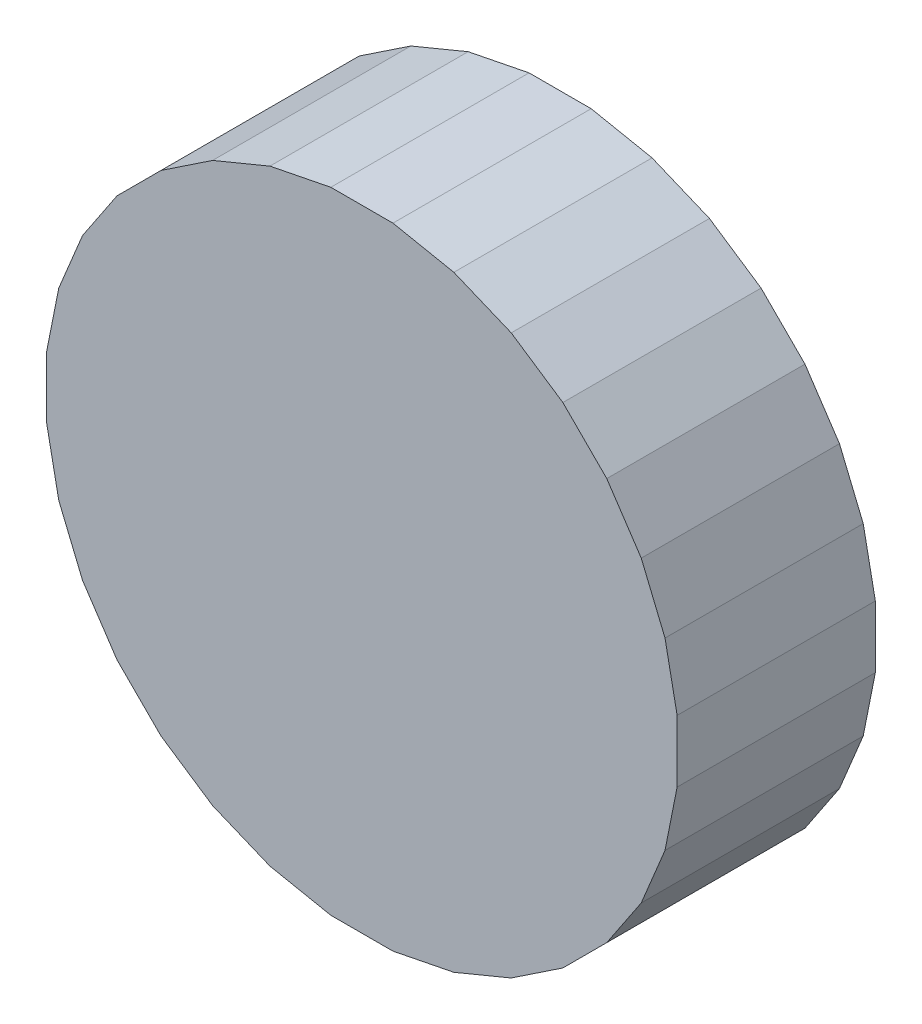
ISO-10303-21;
HEADER;
FILE_DESCRIPTION(('STEP AP214'),'2;1');
FILE_NAME('part.step','',(''),(''),'','','');
FILE_SCHEMA(('AUTOMOTIVE_DESIGN { 1 0 10303 214 1 1 1 1 }'));
ENDSEC;
DATA;
#1=APPLICATION_CONTEXT('core data for automotive mechanical design processes');
#2=APPLICATION_PROTOCOL_DEFINITION('international standard','automotive_design',2000,#1);
#3=PRODUCT_CONTEXT('',#1,'mechanical');
#4=PRODUCT('Part','Part','',(#3));
#5=PRODUCT_RELATED_PRODUCT_CATEGORY('part','',(#4));
#6=PRODUCT_DEFINITION_FORMATION('','',#4);
#7=PRODUCT_DEFINITION_CONTEXT('part definition',#1,'design');
#8=PRODUCT_DEFINITION('design','',#6,#7);
#9=PRODUCT_DEFINITION_SHAPE('','',#8);
#10=(LENGTH_UNIT() NAMED_UNIT(*) SI_UNIT(.MILLI.,.METRE.));
#11=(NAMED_UNIT(*) PLANE_ANGLE_UNIT() SI_UNIT($,.RADIAN.));
#12=(NAMED_UNIT(*) SI_UNIT($,.STERADIAN.) SOLID_ANGLE_UNIT());
#13=UNCERTAINTY_MEASURE_WITH_UNIT(LENGTH_MEASURE(1.E-05),#10,'distance_accuracy_value','');
#14=(GEOMETRIC_REPRESENTATION_CONTEXT(3) GLOBAL_UNCERTAINTY_ASSIGNED_CONTEXT((#13)) GLOBAL_UNIT_ASSIGNED_CONTEXT((#10,
#11,#12)) REPRESENTATION_CONTEXT('',''));
#15=CARTESIAN_POINT('',(0.,0.,0.));
#16=DIRECTION('',(0.,0.,1.));
#17=DIRECTION('',(1.,0.,0.));
#18=AXIS2_PLACEMENT_3D('',#15,#16,#17);
#19=CARTESIAN_POINT('',(-9.570449612419E-07,-9.570449580856E-07,1.10000034));
#20=DIRECTION('',(0.,0.,-1.));
#21=DIRECTION('',(0.,-1.,0.));
#22=AXIS2_PLACEMENT_3D('',#19,#20,#21);
#23=PLANE('',#22);
#24=DIRECTION('',(0.,-1.,0.));
#25=VECTOR('',#24,1.);
#26=CARTESIAN_POINT('',(1.74949104,0.,1.10000034));
#27=LINE('',#26,#25);
#28=CARTESIAN_POINT('',(1.74949104,0.17230852,1.10000034));
#29=VERTEX_POINT('',#28);
#30=CARTESIAN_POINT('',(1.74949104,-0.17231106,1.10000034));
#31=VERTEX_POINT('',#30);
#32=EDGE_CURVE('E552',#29,#31,#27,.T.);
#33=ORIENTED_EDGE('',*,*,#32,.F.);
#34=DIRECTION('',(0.195095506676965,-0.980784249095824,0.));
#35=VECTOR('',#34,1.);
#36=CARTESIAN_POINT('',(1.68225724,0.51030632,1.10000034));
#37=LINE('',#36,#35);
#38=CARTESIAN_POINT('',(1.68225724,0.51030632,1.10000034));
#39=VERTEX_POINT('',#38);
#40=EDGE_CURVE('E303',#39,#29,#37,.T.);
#41=ORIENTED_EDGE('',*,*,#40,.F.);
#42=DIRECTION('',(0.382681822916955,-0.92388019916489,0.));
#43=VECTOR('',#42,1.);
#44=CARTESIAN_POINT('',(1.5503779,0.82869278,1.10000034));
#45=LINE('',#44,#43);
#46=CARTESIAN_POINT('',(1.5503779,0.82869278,1.10000034));
#47=VERTEX_POINT('',#46);
#48=EDGE_CURVE('E306',#47,#39,#45,.T.);
#49=ORIENTED_EDGE('',*,*,#48,.F.);
#50=DIRECTION('',(0.55556733623308,-0.831471547866119,0.));
#51=VECTOR('',#50,1.);
#52=CARTESIAN_POINT('',(1.35891778,1.11523526,1.10000034));
#53=LINE('',#52,#51);
#54=CARTESIAN_POINT('',(1.35891778,1.11523526,1.10000034));
#55=VERTEX_POINT('',#54);
#56=EDGE_CURVE('E456',#55,#47,#53,.T.);
#57=ORIENTED_EDGE('',*,*,#56,.F.);
#58=DIRECTION('',(0.707106781186548,-0.707106781186548,0.));
#59=VECTOR('',#58,1.);
#60=CARTESIAN_POINT('',(1.11523526,1.35891778,1.10000034));
#61=LINE('',#60,#59);
#62=CARTESIAN_POINT('',(1.11523526,1.35891778,1.10000034));
#63=VERTEX_POINT('',#62);
#64=EDGE_CURVE('E472',#63,#55,#61,.T.);
#65=ORIENTED_EDGE('',*,*,#64,.F.);
#66=DIRECTION('',(0.831471547866119,-0.55556733623308,0.));
#67=VECTOR('',#66,1.);
#68=CARTESIAN_POINT('',(0.82869278,1.5503779,1.10000034));
#69=LINE('',#68,#67);
#70=CARTESIAN_POINT('',(0.82869278,1.5503779,1.10000034));
#71=VERTEX_POINT('',#70);
#72=EDGE_CURVE('E408',#71,#63,#69,.T.);
#73=ORIENTED_EDGE('',*,*,#72,.F.);
#74=DIRECTION('',(0.92388019916489,-0.382681822916955,0.));
#75=VECTOR('',#74,1.);
#76=CARTESIAN_POINT('',(0.51030632,1.68225724,1.10000034));
#77=LINE('',#76,#75);
#78=CARTESIAN_POINT('',(0.51030632,1.68225724,1.10000034));
#79=VERTEX_POINT('',#78);
#80=EDGE_CURVE('E423',#79,#71,#77,.T.);
#81=ORIENTED_EDGE('',*,*,#80,.F.);
#82=DIRECTION('',(0.980784249095824,-0.195095506676965,0.));
#83=VECTOR('',#82,1.);
#84=CARTESIAN_POINT('',(0.17230852,1.74949104,1.10000034));
#85=LINE('',#84,#83);
#86=CARTESIAN_POINT('',(0.17230852,1.74949104,1.10000034));
#87=VERTEX_POINT('',#86);
#88=EDGE_CURVE('E511',#87,#79,#85,.T.);
#89=ORIENTED_EDGE('',*,*,#88,.F.);
#90=DIRECTION('',(1.,0.,0.));
#91=VECTOR('',#90,1.);
#92=CARTESIAN_POINT('',(-0.17231106,1.74949104,1.10000034));
#93=LINE('',#92,#91);
#94=CARTESIAN_POINT('',(-0.17231106,1.74949104,1.10000034));
#95=VERTEX_POINT('',#94);
#96=EDGE_CURVE('E432',#95,#87,#93,.T.);
#97=ORIENTED_EDGE('',*,*,#96,.F.);
#98=DIRECTION('',(0.980784249095824,0.195095506676965,0.));
#99=VECTOR('',#98,1.);
#100=CARTESIAN_POINT('',(-0.51030886,1.68225724,1.10000034));
#101=LINE('',#100,#99);
#102=CARTESIAN_POINT('',(-0.51030886,1.68225724,1.10000034));
#103=VERTEX_POINT('',#102);
#104=EDGE_CURVE('E464',#103,#95,#101,.T.);
#105=ORIENTED_EDGE('',*,*,#104,.F.);
#106=DIRECTION('',(0.92388019916489,0.382681822916955,0.));
#107=VECTOR('',#106,1.);
#108=CARTESIAN_POINT('',(-0.82869532,1.5503779,1.10000034));
#109=LINE('',#108,#107);
#110=CARTESIAN_POINT('',(-0.82869532,1.5503779,1.10000034));
#111=VERTEX_POINT('',#110);
#112=EDGE_CURVE('E414',#111,#103,#109,.T.);
#113=ORIENTED_EDGE('',*,*,#112,.F.);
#114=DIRECTION('',(0.831471547866119,0.55556733623308,0.));
#115=VECTOR('',#114,1.);
#116=CARTESIAN_POINT('',(-1.1152378,1.35891778,1.10000034));
#117=LINE('',#116,#115);
#118=CARTESIAN_POINT('',(-1.1152378,1.35891778,1.10000034));
#119=VERTEX_POINT('',#118);
#120=EDGE_CURVE('E341',#119,#111,#117,.T.);
#121=ORIENTED_EDGE('',*,*,#120,.F.);
#122=DIRECTION('',(0.707106781186548,0.707106781186548,0.));
#123=VECTOR('',#122,1.);
#124=CARTESIAN_POINT('',(-1.35892032,1.11523526,1.10000034));
#125=LINE('',#124,#123);
#126=CARTESIAN_POINT('',(-1.35892032,1.11523526,1.10000034));
#127=VERTEX_POINT('',#126);
#128=EDGE_CURVE('E497',#127,#119,#125,.T.);
#129=ORIENTED_EDGE('',*,*,#128,.F.);
#130=DIRECTION('',(0.55556733623308,0.831471547866119,0.));
#131=VECTOR('',#130,1.);
#132=CARTESIAN_POINT('',(-1.55038044,0.82869278,1.10000034));
#133=LINE('',#132,#131);
#134=CARTESIAN_POINT('',(-1.55038044,0.82869278,1.10000034));
#135=VERTEX_POINT('',#134);
#136=EDGE_CURVE('E367',#135,#127,#133,.T.);
#137=ORIENTED_EDGE('',*,*,#136,.F.);
#138=DIRECTION('',(0.382681822916955,0.92388019916489,0.));
#139=VECTOR('',#138,1.);
#140=CARTESIAN_POINT('',(-1.68225978,0.51030632,1.10000034));
#141=LINE('',#140,#139);
#142=CARTESIAN_POINT('',(-1.68225978,0.51030632,1.10000034));
#143=VERTEX_POINT('',#142);
#144=EDGE_CURVE('E480',#143,#135,#141,.T.);
#145=ORIENTED_EDGE('',*,*,#144,.F.);
#146=DIRECTION('',(0.195088416759098,0.980785659380493,0.));
#147=VECTOR('',#146,1.);
#148=CARTESIAN_POINT('',(-1.74949104,0.17230852,1.10000034));
#149=LINE('',#148,#147);
#150=CARTESIAN_POINT('',(-1.74949104,0.17230852,1.10000034));
#151=VERTEX_POINT('',#150);
#152=EDGE_CURVE('E323',#151,#143,#149,.T.);
#153=ORIENTED_EDGE('',*,*,#152,.F.);
#154=DIRECTION('',(0.,1.,0.));
#155=VECTOR('',#154,1.);
#156=CARTESIAN_POINT('',(-1.74949104,-0.17231106,1.10000034));
#157=LINE('',#156,#155);
#158=CARTESIAN_POINT('',(-1.74949104,-0.17231106,1.10000034));
#159=VERTEX_POINT('',#158);
#160=EDGE_CURVE('E445',#159,#151,#157,.T.);
#161=ORIENTED_EDGE('',*,*,#160,.F.);
#162=DIRECTION('',(-0.195088416759098,0.980785659380493,0.));
#163=VECTOR('',#162,1.);
#164=CARTESIAN_POINT('',(-1.68225978,-0.51030886,1.10000034));
#165=LINE('',#164,#163);
#166=CARTESIAN_POINT('',(-1.68225978,-0.51030886,1.10000034));
#167=VERTEX_POINT('',#166);
#168=EDGE_CURVE('E355',#167,#159,#165,.T.);
#169=ORIENTED_EDGE('',*,*,#168,.F.);
#170=DIRECTION('',(-0.382681822916955,0.92388019916489,0.));
#171=VECTOR('',#170,1.);
#172=CARTESIAN_POINT('',(-1.55038044,-0.82869532,1.10000034));
#173=LINE('',#172,#171);
#174=CARTESIAN_POINT('',(-1.55038044,-0.82869532,1.10000034));
#175=VERTEX_POINT('',#174);
#176=EDGE_CURVE('E415',#175,#167,#173,.T.);
#177=ORIENTED_EDGE('',*,*,#176,.F.);
#178=DIRECTION('',(-0.55556733623308,0.831471547866119,0.));
#179=VECTOR('',#178,1.);
#180=CARTESIAN_POINT('',(-1.35892032,-1.1152378,1.10000034));
#181=LINE('',#180,#179);
#182=CARTESIAN_POINT('',(-1.35892032,-1.1152378,1.10000034));
#183=VERTEX_POINT('',#182);
#184=EDGE_CURVE('E399',#183,#175,#181,.T.);
#185=ORIENTED_EDGE('',*,*,#184,.F.);
#186=DIRECTION('',(-0.707106781186548,0.707106781186548,0.));
#187=VECTOR('',#186,1.);
#188=CARTESIAN_POINT('',(-1.1152378,-1.35892032,1.10000034));
#189=LINE('',#188,#187);
#190=CARTESIAN_POINT('',(-1.1152378,-1.35892032,1.10000034));
#191=VERTEX_POINT('',#190);
#192=EDGE_CURVE('E330',#191,#183,#189,.T.);
#193=ORIENTED_EDGE('',*,*,#192,.F.);
#194=DIRECTION('',(-0.831471547866119,0.55556733623308,0.));
#195=VECTOR('',#194,1.);
#196=CARTESIAN_POINT('',(-0.82869532,-1.55038044,1.10000034));
#197=LINE('',#196,#195);
#198=CARTESIAN_POINT('',(-0.82869532,-1.55038044,1.10000034));
#199=VERTEX_POINT('',#198);
#200=EDGE_CURVE('E377',#199,#191,#197,.T.);
#201=ORIENTED_EDGE('',*,*,#200,.F.);
#202=DIRECTION('',(-0.92388019916489,0.382681822916955,0.));
#203=VECTOR('',#202,1.);
#204=CARTESIAN_POINT('',(-0.51030886,-1.68225978,1.10000034));
#205=LINE('',#204,#203);
#206=CARTESIAN_POINT('',(-0.51030886,-1.68225978,1.10000034));
#207=VERTEX_POINT('',#206);
#208=EDGE_CURVE('E368',#207,#199,#205,.T.);
#209=ORIENTED_EDGE('',*,*,#208,.F.);
#210=DIRECTION('',(-0.980785659380493,0.195088416759098,0.));
#211=VECTOR('',#210,1.);
#212=CARTESIAN_POINT('',(-0.17231106,-1.74949104,1.10000034));
#213=LINE('',#212,#211);
#214=CARTESIAN_POINT('',(-0.17231106,-1.74949104,1.10000034));
#215=VERTEX_POINT('',#214);
#216=EDGE_CURVE('E350',#215,#207,#213,.T.);
#217=ORIENTED_EDGE('',*,*,#216,.F.);
#218=DIRECTION('',(-1.,0.,0.));
#219=VECTOR('',#218,1.);
#220=CARTESIAN_POINT('',(0.17230852,-1.74949104,1.10000034));
#221=LINE('',#220,#219);
#222=CARTESIAN_POINT('',(0.17230852,-1.74949104,1.10000034));
#223=VERTEX_POINT('',#222);
#224=EDGE_CURVE('E340',#223,#215,#221,.T.);
#225=ORIENTED_EDGE('',*,*,#224,.F.);
#226=DIRECTION('',(-0.980785659380493,-0.195088416759098,0.));
#227=VECTOR('',#226,1.);
#228=CARTESIAN_POINT('',(0.51030632,-1.68225978,1.10000034));
#229=LINE('',#228,#227);
#230=CARTESIAN_POINT('',(0.51030632,-1.68225978,1.10000034));
#231=VERTEX_POINT('',#230);
#232=EDGE_CURVE('E329',#231,#223,#229,.T.);
#233=ORIENTED_EDGE('',*,*,#232,.F.);
#234=DIRECTION('',(-0.92388019916489,-0.382681822916955,0.));
#235=VECTOR('',#234,1.);
#236=CARTESIAN_POINT('',(0.82869278,-1.55038044,1.10000034));
#237=LINE('',#236,#235);
#238=CARTESIAN_POINT('',(0.82869278,-1.55038044,1.10000034));
#239=VERTEX_POINT('',#238);
#240=EDGE_CURVE('E613',#239,#231,#237,.T.);
#241=ORIENTED_EDGE('',*,*,#240,.F.);
#242=DIRECTION('',(-0.831471547866119,-0.55556733623308,0.));
#243=VECTOR('',#242,1.);
#244=CARTESIAN_POINT('',(1.11523526,-1.35892032,1.10000034));
#245=LINE('',#244,#243);
#246=CARTESIAN_POINT('',(1.11523526,-1.35892032,1.10000034));
#247=VERTEX_POINT('',#246);
#248=EDGE_CURVE('E586',#247,#239,#245,.T.);
#249=ORIENTED_EDGE('',*,*,#248,.F.);
#250=DIRECTION('',(-0.707106781186548,-0.707106781186548,0.));
#251=VECTOR('',#250,1.);
#252=CARTESIAN_POINT('',(1.35891778,-1.1152378,1.10000034));
#253=LINE('',#252,#251);
#254=CARTESIAN_POINT('',(1.35891778,-1.1152378,1.10000034));
#255=VERTEX_POINT('',#254);
#256=EDGE_CURVE('E609',#255,#247,#253,.T.);
#257=ORIENTED_EDGE('',*,*,#256,.F.);
#258=DIRECTION('',(-0.55556733623308,-0.831471547866119,0.));
#259=VECTOR('',#258,1.);
#260=CARTESIAN_POINT('',(1.5503779,-0.82869532,1.10000034));
#261=LINE('',#260,#259);
#262=CARTESIAN_POINT('',(1.5503779,-0.82869532,1.10000034));
#263=VERTEX_POINT('',#262);
#264=EDGE_CURVE('E574',#263,#255,#261,.T.);
#265=ORIENTED_EDGE('',*,*,#264,.F.);
#266=DIRECTION('',(-0.382681822916955,-0.92388019916489,0.));
#267=VECTOR('',#266,1.);
#268=CARTESIAN_POINT('',(1.68225724,-0.51030886,1.10000034));
#269=LINE('',#268,#267);
#270=CARTESIAN_POINT('',(1.68225724,-0.51030886,1.10000034));
#271=VERTEX_POINT('',#270);
#272=EDGE_CURVE('E579',#271,#263,#269,.T.);
#273=ORIENTED_EDGE('',*,*,#272,.F.);
#274=DIRECTION('',(-0.195095506676965,-0.980784249095824,0.));
#275=VECTOR('',#274,1.);
#276=CARTESIAN_POINT('',(1.74949104,-0.17231106,1.10000034));
#277=LINE('',#276,#275);
#278=EDGE_CURVE('E555',#31,#271,#277,.T.);
#279=ORIENTED_EDGE('',*,*,#278,.F.);
#280=EDGE_LOOP('',(#33,#41,#49,#57,#65,#73,#81,#89,#97,#105,#113,#121,#129,#137,#145,#153,#161,
#169,#177,#185,#193,#201,#209,#217,#225,#233,#241,#249,#257,#265,#273,#279));
#281=FACE_BOUND('',#280,.T.);
#282=ADVANCED_FACE('F17',(#281),#23,.F.);
#283=CARTESIAN_POINT('',(-9.570449612419E-07,-9.570449580856E-07,0.));
#284=DIRECTION('',(0.,0.,-1.));
#285=DIRECTION('',(0.,-1.,0.));
#286=AXIS2_PLACEMENT_3D('',#283,#284,#285);
#287=PLANE('',#286);
#288=DIRECTION('',(0.,-1.,0.));
#289=VECTOR('',#288,1.);
#290=CARTESIAN_POINT('',(1.74949104,0.,0.));
#291=LINE('',#290,#289);
#292=CARTESIAN_POINT('',(1.74949104,0.17230852,0.));
#293=VERTEX_POINT('',#292);
#294=CARTESIAN_POINT('',(1.74949104,-0.17231106,0.));
#295=VERTEX_POINT('',#294);
#296=EDGE_CURVE('E39',#293,#295,#291,.T.);
#297=ORIENTED_EDGE('',*,*,#296,.T.);
#298=DIRECTION('',(-0.195095506676965,-0.980784249095824,0.));
#299=VECTOR('',#298,1.);
#300=CARTESIAN_POINT('',(1.74949104,-0.17231106,0.));
#301=LINE('',#300,#299);
#302=CARTESIAN_POINT('',(1.68225724,-0.51030886,0.));
#303=VERTEX_POINT('',#302);
#304=EDGE_CURVE('E575',#295,#303,#301,.T.);
#305=ORIENTED_EDGE('',*,*,#304,.T.);
#306=DIRECTION('',(-0.382681822916955,-0.92388019916489,0.));
#307=VECTOR('',#306,1.);
#308=CARTESIAN_POINT('',(1.68225724,-0.51030886,0.));
#309=LINE('',#308,#307);
#310=CARTESIAN_POINT('',(1.5503779,-0.82869532,0.));
#311=VERTEX_POINT('',#310);
#312=EDGE_CURVE('E594',#303,#311,#309,.T.);
#313=ORIENTED_EDGE('',*,*,#312,.T.);
#314=DIRECTION('',(-0.55556733623308,-0.831471547866119,0.));
#315=VECTOR('',#314,1.);
#316=CARTESIAN_POINT('',(1.5503779,-0.82869532,0.));
#317=LINE('',#316,#315);
#318=CARTESIAN_POINT('',(1.35891778,-1.1152378,0.));
#319=VERTEX_POINT('',#318);
#320=EDGE_CURVE('E573',#311,#319,#317,.T.);
#321=ORIENTED_EDGE('',*,*,#320,.T.);
#322=DIRECTION('',(-0.707106781186548,-0.707106781186548,0.));
#323=VECTOR('',#322,1.);
#324=CARTESIAN_POINT('',(1.35891778,-1.1152378,0.));
#325=LINE('',#324,#323);
#326=CARTESIAN_POINT('',(1.11523526,-1.35892032,0.));
#327=VERTEX_POINT('',#326);
#328=EDGE_CURVE('E582',#319,#327,#325,.T.);
#329=ORIENTED_EDGE('',*,*,#328,.T.);
#330=DIRECTION('',(-0.831471547866119,-0.55556733623308,0.));
#331=VECTOR('',#330,1.);
#332=CARTESIAN_POINT('',(1.11523526,-1.35892032,0.));
#333=LINE('',#332,#331);
#334=CARTESIAN_POINT('',(0.82869278,-1.55038044,0.));
#335=VERTEX_POINT('',#334);
#336=EDGE_CURVE('E618',#327,#335,#333,.T.);
#337=ORIENTED_EDGE('',*,*,#336,.T.);
#338=DIRECTION('',(-0.92388019916489,-0.382681822916955,0.));
#339=VECTOR('',#338,1.);
#340=CARTESIAN_POINT('',(0.82869278,-1.55038044,0.));
#341=LINE('',#340,#339);
#342=CARTESIAN_POINT('',(0.51030632,-1.68225978,0.));
#343=VERTEX_POINT('',#342);
#344=EDGE_CURVE('E316',#335,#343,#341,.T.);
#345=ORIENTED_EDGE('',*,*,#344,.T.);
#346=DIRECTION('',(-0.980785659380493,-0.195088416759098,0.));
#347=VECTOR('',#346,1.);
#348=CARTESIAN_POINT('',(0.51030632,-1.68225978,0.));
#349=LINE('',#348,#347);
#350=CARTESIAN_POINT('',(0.17230852,-1.74949104,0.));
#351=VERTEX_POINT('',#350);
#352=EDGE_CURVE('E328',#343,#351,#349,.T.);
#353=ORIENTED_EDGE('',*,*,#352,.T.);
#354=DIRECTION('',(-1.,0.,0.));
#355=VECTOR('',#354,1.);
#356=CARTESIAN_POINT('',(0.17230852,-1.74949104,0.));
#357=LINE('',#356,#355);
#358=CARTESIAN_POINT('',(-0.17231106,-1.74949104,0.));
#359=VERTEX_POINT('',#358);
#360=EDGE_CURVE('E336',#351,#359,#357,.T.);
#361=ORIENTED_EDGE('',*,*,#360,.T.);
#362=DIRECTION('',(-0.980785659380493,0.195088416759098,0.));
#363=VECTOR('',#362,1.);
#364=CARTESIAN_POINT('',(-0.17231106,-1.74949104,0.));
#365=LINE('',#364,#363);
#366=CARTESIAN_POINT('',(-0.51030886,-1.68225978,0.));
#367=VERTEX_POINT('',#366);
#368=EDGE_CURVE('E361',#359,#367,#365,.T.);
#369=ORIENTED_EDGE('',*,*,#368,.T.);
#370=DIRECTION('',(-0.92388019916489,0.382681822916955,0.));
#371=VECTOR('',#370,1.);
#372=CARTESIAN_POINT('',(-0.51030886,-1.68225978,0.));
#373=LINE('',#372,#371);
#374=CARTESIAN_POINT('',(-0.82869532,-1.55038044,0.));
#375=VERTEX_POINT('',#374);
#376=EDGE_CURVE('E376',#367,#375,#373,.T.);
#377=ORIENTED_EDGE('',*,*,#376,.T.);
#378=DIRECTION('',(-0.831471547866119,0.55556733623308,0.));
#379=VECTOR('',#378,1.);
#380=CARTESIAN_POINT('',(-0.82869532,-1.55038044,0.));
#381=LINE('',#380,#379);
#382=CARTESIAN_POINT('',(-1.1152378,-1.35892032,0.));
#383=VERTEX_POINT('',#382);
#384=EDGE_CURVE('E335',#375,#383,#381,.T.);
#385=ORIENTED_EDGE('',*,*,#384,.T.);
#386=DIRECTION('',(-0.707106781186548,0.707106781186548,0.));
#387=VECTOR('',#386,1.);
#388=CARTESIAN_POINT('',(-1.1152378,-1.35892032,0.));
#389=LINE('',#388,#387);
#390=CARTESIAN_POINT('',(-1.35892032,-1.1152378,0.));
#391=VERTEX_POINT('',#390);
#392=EDGE_CURVE('E390',#383,#391,#389,.T.);
#393=ORIENTED_EDGE('',*,*,#392,.T.);
#394=DIRECTION('',(-0.55556733623308,0.831471547866119,0.));
#395=VECTOR('',#394,1.);
#396=CARTESIAN_POINT('',(-1.35892032,-1.1152378,0.));
#397=LINE('',#396,#395);
#398=CARTESIAN_POINT('',(-1.55038044,-0.82869532,0.));
#399=VERTEX_POINT('',#398);
#400=EDGE_CURVE('E419',#391,#399,#397,.T.);
#401=ORIENTED_EDGE('',*,*,#400,.T.);
#402=DIRECTION('',(-0.382681822916955,0.92388019916489,0.));
#403=VECTOR('',#402,1.);
#404=CARTESIAN_POINT('',(-1.55038044,-0.82869532,0.));
#405=LINE('',#404,#403);
#406=CARTESIAN_POINT('',(-1.68225978,-0.51030886,0.));
#407=VERTEX_POINT('',#406);
#408=EDGE_CURVE('E351',#399,#407,#405,.T.);
#409=ORIENTED_EDGE('',*,*,#408,.T.);
#410=DIRECTION('',(-0.195088416759098,0.980785659380493,0.));
#411=VECTOR('',#410,1.);
#412=CARTESIAN_POINT('',(-1.68225978,-0.51030886,0.));
#413=LINE('',#412,#411);
#414=CARTESIAN_POINT('',(-1.74949104,-0.17231106,0.));
#415=VERTEX_POINT('',#414);
#416=EDGE_CURVE('E437',#407,#415,#413,.T.);
#417=ORIENTED_EDGE('',*,*,#416,.T.);
#418=DIRECTION('',(0.,1.,0.));
#419=VECTOR('',#418,1.);
#420=CARTESIAN_POINT('',(-1.74949104,-0.17231106,0.));
#421=LINE('',#420,#419);
#422=CARTESIAN_POINT('',(-1.74949104,0.17230852,0.));
#423=VERTEX_POINT('',#422);
#424=EDGE_CURVE('E450',#415,#423,#421,.T.);
#425=ORIENTED_EDGE('',*,*,#424,.T.);
#426=DIRECTION('',(0.195088416759098,0.980785659380493,0.));
#427=VECTOR('',#426,1.);
#428=CARTESIAN_POINT('',(-1.74949104,0.17230852,0.));
#429=LINE('',#428,#427);
#430=CARTESIAN_POINT('',(-1.68225978,0.51030632,0.));
#431=VERTEX_POINT('',#430);
#432=EDGE_CURVE('E322',#423,#431,#429,.T.);
#433=ORIENTED_EDGE('',*,*,#432,.T.);
#434=DIRECTION('',(0.382681822916955,0.92388019916489,0.));
#435=VECTOR('',#434,1.);
#436=CARTESIAN_POINT('',(-1.68225978,0.51030632,0.));
#437=LINE('',#436,#435);
#438=CARTESIAN_POINT('',(-1.55038044,0.82869278,0.));
#439=VERTEX_POINT('',#438);
#440=EDGE_CURVE('E485',#431,#439,#437,.T.);
#441=ORIENTED_EDGE('',*,*,#440,.T.);
#442=DIRECTION('',(0.55556733623308,0.831471547866119,0.));
#443=VECTOR('',#442,1.);
#444=CARTESIAN_POINT('',(-1.55038044,0.82869278,0.));
#445=LINE('',#444,#443);
#446=CARTESIAN_POINT('',(-1.35892032,1.11523526,0.));
#447=VERTEX_POINT('',#446);
#448=EDGE_CURVE('E366',#439,#447,#445,.T.);
#449=ORIENTED_EDGE('',*,*,#448,.T.);
#450=DIRECTION('',(0.707106781186548,0.707106781186548,0.));
#451=VECTOR('',#450,1.);
#452=CARTESIAN_POINT('',(-1.35892032,1.11523526,0.));
#453=LINE('',#452,#451);
#454=CARTESIAN_POINT('',(-1.1152378,1.35891778,0.));
#455=VERTEX_POINT('',#454);
#456=EDGE_CURVE('E346',#447,#455,#453,.T.);
#457=ORIENTED_EDGE('',*,*,#456,.T.);
#458=DIRECTION('',(0.831471547866119,0.55556733623308,0.));
#459=VECTOR('',#458,1.);
#460=CARTESIAN_POINT('',(-1.1152378,1.35891778,0.));
#461=LINE('',#460,#459);
#462=CARTESIAN_POINT('',(-0.82869532,1.5503779,0.));
#463=VERTEX_POINT('',#462);
#464=EDGE_CURVE('E410',#455,#463,#461,.T.);
#465=ORIENTED_EDGE('',*,*,#464,.T.);
#466=DIRECTION('',(0.92388019916489,0.382681822916955,0.));
#467=VECTOR('',#466,1.);
#468=CARTESIAN_POINT('',(-0.82869532,1.5503779,0.));
#469=LINE('',#468,#467);
#470=CARTESIAN_POINT('',(-0.51030886,1.68225724,0.));
#471=VERTEX_POINT('',#470);
#472=EDGE_CURVE('E460',#463,#471,#469,.T.);
#473=ORIENTED_EDGE('',*,*,#472,.T.);
#474=DIRECTION('',(0.980784249095824,0.195095506676965,0.));
#475=VECTOR('',#474,1.);
#476=CARTESIAN_POINT('',(-0.51030886,1.68225724,0.));
#477=LINE('',#476,#475);
#478=CARTESIAN_POINT('',(-0.17231106,1.74949104,0.));
#479=VERTEX_POINT('',#478);
#480=EDGE_CURVE('E428',#471,#479,#477,.T.);
#481=ORIENTED_EDGE('',*,*,#480,.T.);
#482=DIRECTION('',(1.,0.,0.));
#483=VECTOR('',#482,1.);
#484=CARTESIAN_POINT('',(-0.17231106,1.74949104,0.));
#485=LINE('',#484,#483);
#486=CARTESIAN_POINT('',(0.17230852,1.74949104,0.));
#487=VERTEX_POINT('',#486);
#488=EDGE_CURVE('E523',#479,#487,#485,.T.);
#489=ORIENTED_EDGE('',*,*,#488,.T.);
#490=DIRECTION('',(0.980784249095824,-0.195095506676965,0.));
#491=VECTOR('',#490,1.);
#492=CARTESIAN_POINT('',(0.17230852,1.74949104,0.));
#493=LINE('',#492,#491);
#494=CARTESIAN_POINT('',(0.51030632,1.68225724,0.));
#495=VERTEX_POINT('',#494);
#496=EDGE_CURVE('E427',#487,#495,#493,.T.);
#497=ORIENTED_EDGE('',*,*,#496,.T.);
#498=DIRECTION('',(0.92388019916489,-0.382681822916955,0.));
#499=VECTOR('',#498,1.);
#500=CARTESIAN_POINT('',(0.51030632,1.68225724,0.));
#501=LINE('',#500,#499);
#502=CARTESIAN_POINT('',(0.82869278,1.5503779,0.));
#503=VERTEX_POINT('',#502);
#504=EDGE_CURVE('E404',#495,#503,#501,.T.);
#505=ORIENTED_EDGE('',*,*,#504,.T.);
#506=DIRECTION('',(0.831471547866119,-0.55556733623308,0.));
#507=VECTOR('',#506,1.);
#508=CARTESIAN_POINT('',(0.82869278,1.5503779,0.));
#509=LINE('',#508,#507);
#510=CARTESIAN_POINT('',(1.11523526,1.35891778,0.));
#511=VERTEX_POINT('',#510);
#512=EDGE_CURVE('E476',#503,#511,#509,.T.);
#513=ORIENTED_EDGE('',*,*,#512,.T.);
#514=DIRECTION('',(0.707106781186548,-0.707106781186548,0.));
#515=VECTOR('',#514,1.);
#516=CARTESIAN_POINT('',(1.11523526,1.35891778,0.));
#517=LINE('',#516,#515);
#518=CARTESIAN_POINT('',(1.35891778,1.11523526,0.));
#519=VERTEX_POINT('',#518);
#520=EDGE_CURVE('E453',#511,#519,#517,.T.);
#521=ORIENTED_EDGE('',*,*,#520,.T.);
#522=DIRECTION('',(0.55556733623308,-0.831471547866119,0.));
#523=VECTOR('',#522,1.);
#524=CARTESIAN_POINT('',(1.35891778,1.11523526,0.));
#525=LINE('',#524,#523);
#526=CARTESIAN_POINT('',(1.5503779,0.82869278,0.));
#527=VERTEX_POINT('',#526);
#528=EDGE_CURVE('E298',#519,#527,#525,.T.);
#529=ORIENTED_EDGE('',*,*,#528,.T.);
#530=DIRECTION('',(0.382681822916955,-0.92388019916489,0.));
#531=VECTOR('',#530,1.);
#532=CARTESIAN_POINT('',(1.5503779,0.82869278,0.));
#533=LINE('',#532,#531);
#534=CARTESIAN_POINT('',(1.68225724,0.51030632,0.));
#535=VERTEX_POINT('',#534);
#536=EDGE_CURVE('E295',#527,#535,#533,.T.);
#537=ORIENTED_EDGE('',*,*,#536,.T.);
#538=DIRECTION('',(0.195095506676965,-0.980784249095824,0.));
#539=VECTOR('',#538,1.);
#540=CARTESIAN_POINT('',(1.68225724,0.51030632,0.));
#541=LINE('',#540,#539);
#542=EDGE_CURVE('E11',#535,#293,#541,.T.);
#543=ORIENTED_EDGE('',*,*,#542,.T.);
#544=EDGE_LOOP('',(#297,#305,#313,#321,#329,#337,#345,#353,#361,#369,#377,#385,#393,#401,#409,
#417,#425,#433,#441,#449,#457,#465,#473,#481,#489,#497,#505,#513,#521,#529,#537,#543));
#545=FACE_BOUND('',#544,.T.);
#546=ADVANCED_FACE('F296',(#545),#287,.T.);
#547=CARTESIAN_POINT('',(1.68225724,0.51030632,0.));
#548=DIRECTION('',(0.980784249095824,0.195095506676965,0.));
#549=DIRECTION('',(0.,0.,-1.));
#550=AXIS2_PLACEMENT_3D('',#547,#548,#549);
#551=PLANE('',#550);
#552=DIRECTION('',(0.,0.,1.));
#553=VECTOR('',#552,1.);
#554=CARTESIAN_POINT('',(1.68225724,0.51030632,0.));
#555=LINE('',#554,#553);
#556=EDGE_CURVE('E291',#535,#39,#555,.T.);
#557=ORIENTED_EDGE('',*,*,#556,.T.);
#558=ORIENTED_EDGE('',*,*,#40,.T.);
#559=DIRECTION('',(0.,0.,1.));
#560=VECTOR('',#559,1.);
#561=CARTESIAN_POINT('',(1.74949104,0.17230852,0.));
#562=LINE('',#561,#560);
#563=EDGE_CURVE('E27',#293,#29,#562,.T.);
#564=ORIENTED_EDGE('',*,*,#563,.F.);
#565=ORIENTED_EDGE('',*,*,#542,.F.);
#566=EDGE_LOOP('',(#557,#558,#564,#565));
#567=FACE_BOUND('',#566,.T.);
#568=ADVANCED_FACE('F19',(#567),#551,.T.);
#569=CARTESIAN_POINT('',(1.5503779,0.82869278,0.));
#570=DIRECTION('',(0.92388019916489,0.382681822916955,0.));
#571=DIRECTION('',(0.,0.,-1.));
#572=AXIS2_PLACEMENT_3D('',#569,#570,#571);
#573=PLANE('',#572);
#574=DIRECTION('',(0.,0.,1.));
#575=VECTOR('',#574,1.);
#576=CARTESIAN_POINT('',(1.5503779,0.82869278,0.));
#577=LINE('',#576,#575);
#578=EDGE_CURVE('E471',#527,#47,#577,.T.);
#579=ORIENTED_EDGE('',*,*,#578,.T.);
#580=ORIENTED_EDGE('',*,*,#48,.T.);
#581=ORIENTED_EDGE('',*,*,#556,.F.);
#582=ORIENTED_EDGE('',*,*,#536,.F.);
#583=EDGE_LOOP('',(#579,#580,#581,#582));
#584=FACE_BOUND('',#583,.T.);
#585=ADVANCED_FACE('F305',(#584),#573,.T.);
#586=CARTESIAN_POINT('',(1.35891778,1.11523526,0.));
#587=DIRECTION('',(0.831471547866119,0.55556733623308,0.));
#588=DIRECTION('',(0.,0.,-1.));
#589=AXIS2_PLACEMENT_3D('',#586,#587,#588);
#590=PLANE('',#589);
#591=DIRECTION('',(0.,0.,1.));
#592=VECTOR('',#591,1.);
#593=CARTESIAN_POINT('',(1.35891778,1.11523526,0.));
#594=LINE('',#593,#592);
#595=EDGE_CURVE('E457',#519,#55,#594,.T.);
#596=ORIENTED_EDGE('',*,*,#595,.T.);
#597=ORIENTED_EDGE('',*,*,#56,.T.);
#598=ORIENTED_EDGE('',*,*,#578,.F.);
#599=ORIENTED_EDGE('',*,*,#528,.F.);
#600=EDGE_LOOP('',(#596,#597,#598,#599));
#601=FACE_BOUND('',#600,.T.);
#602=ADVANCED_FACE('F716',(#601),#590,.T.);
#603=CARTESIAN_POINT('',(1.11523526,1.35891778,0.));
#604=DIRECTION('',(0.707106781186548,0.707106781186548,0.));
#605=DIRECTION('',(0.,0.,-1.));
#606=AXIS2_PLACEMENT_3D('',#603,#604,#605);
#607=PLANE('',#606);
#608=DIRECTION('',(0.,0.,1.));
#609=VECTOR('',#608,1.);
#610=CARTESIAN_POINT('',(1.11523526,1.35891778,0.));
#611=LINE('',#610,#609);
#612=EDGE_CURVE('E533',#511,#63,#611,.T.);
#613=ORIENTED_EDGE('',*,*,#612,.T.);
#614=ORIENTED_EDGE('',*,*,#64,.T.);
#615=ORIENTED_EDGE('',*,*,#595,.F.);
#616=ORIENTED_EDGE('',*,*,#520,.F.);
#617=EDGE_LOOP('',(#613,#614,#615,#616));
#618=FACE_BOUND('',#617,.T.);
#619=ADVANCED_FACE('F721',(#618),#607,.T.);
#620=CARTESIAN_POINT('',(0.82869278,1.5503779,0.));
#621=DIRECTION('',(0.55556733623308,0.831471547866119,0.));
#622=DIRECTION('',(0.,0.,-1.));
#623=AXIS2_PLACEMENT_3D('',#620,#621,#622);
#624=PLANE('',#623);
#625=DIRECTION('',(0.,0.,1.));
#626=VECTOR('',#625,1.);
#627=CARTESIAN_POINT('',(0.82869278,1.5503779,0.));
#628=LINE('',#627,#626);
#629=EDGE_CURVE('E409',#503,#71,#628,.T.);
#630=ORIENTED_EDGE('',*,*,#629,.T.);
#631=ORIENTED_EDGE('',*,*,#72,.T.);
#632=ORIENTED_EDGE('',*,*,#612,.F.);
#633=ORIENTED_EDGE('',*,*,#512,.F.);
#634=EDGE_LOOP('',(#630,#631,#632,#633));
#635=FACE_BOUND('',#634,.T.);
#636=ADVANCED_FACE('F729',(#635),#624,.T.);
#637=CARTESIAN_POINT('',(0.51030632,1.68225724,0.));
#638=DIRECTION('',(0.382681822916955,0.92388019916489,0.));
#639=DIRECTION('',(0.,0.,-1.));
#640=AXIS2_PLACEMENT_3D('',#637,#638,#639);
#641=PLANE('',#640);
#642=DIRECTION('',(0.,0.,1.));
#643=VECTOR('',#642,1.);
#644=CARTESIAN_POINT('',(0.51030632,1.68225724,0.));
#645=LINE('',#644,#643);
#646=EDGE_CURVE('E507',#495,#79,#645,.T.);
#647=ORIENTED_EDGE('',*,*,#646,.T.);
#648=ORIENTED_EDGE('',*,*,#80,.T.);
#649=ORIENTED_EDGE('',*,*,#629,.F.);
#650=ORIENTED_EDGE('',*,*,#504,.F.);
#651=EDGE_LOOP('',(#647,#648,#649,#650));
#652=FACE_BOUND('',#651,.T.);
#653=ADVANCED_FACE('F738',(#652),#641,.T.);
#654=CARTESIAN_POINT('',(0.17230852,1.74949104,0.));
#655=DIRECTION('',(0.195095506676965,0.980784249095824,0.));
#656=DIRECTION('',(0.,0.,-1.));
#657=AXIS2_PLACEMENT_3D('',#654,#655,#656);
#658=PLANE('',#657);
#659=DIRECTION('',(0.,0.,1.));
#660=VECTOR('',#659,1.);
#661=CARTESIAN_POINT('',(0.17230852,1.74949104,0.));
#662=LINE('',#661,#660);
#663=EDGE_CURVE('E526',#487,#87,#662,.T.);
#664=ORIENTED_EDGE('',*,*,#663,.T.);
#665=ORIENTED_EDGE('',*,*,#88,.T.);
#666=ORIENTED_EDGE('',*,*,#646,.F.);
#667=ORIENTED_EDGE('',*,*,#496,.F.);
#668=EDGE_LOOP('',(#664,#665,#666,#667));
#669=FACE_BOUND('',#668,.T.);
#670=ADVANCED_FACE('F747',(#669),#658,.T.);
#671=CARTESIAN_POINT('',(-0.17231106,1.74949104,0.));
#672=DIRECTION('',(0.,1.,0.));
#673=DIRECTION('',(1.,0.,0.));
#674=AXIS2_PLACEMENT_3D('',#671,#672,#673);
#675=PLANE('',#674);
#676=DIRECTION('',(0.,0.,1.));
#677=VECTOR('',#676,1.);
#678=CARTESIAN_POINT('',(-0.17231106,1.74949104,0.));
#679=LINE('',#678,#677);
#680=EDGE_CURVE('E433',#479,#95,#679,.T.);
#681=ORIENTED_EDGE('',*,*,#680,.T.);
#682=ORIENTED_EDGE('',*,*,#96,.T.);
#683=ORIENTED_EDGE('',*,*,#663,.F.);
#684=ORIENTED_EDGE('',*,*,#488,.F.);
#685=EDGE_LOOP('',(#681,#682,#683,#684));
#686=FACE_BOUND('',#685,.T.);
#687=ADVANCED_FACE('F756',(#686),#675,.T.);
#688=CARTESIAN_POINT('',(-0.51030886,1.68225724,0.));
#689=DIRECTION('',(-0.195095506676965,0.980784249095824,0.));
#690=DIRECTION('',(0.,0.,1.));
#691=AXIS2_PLACEMENT_3D('',#688,#689,#690);
#692=PLANE('',#691);
#693=DIRECTION('',(0.,0.,1.));
#694=VECTOR('',#693,1.);
#695=CARTESIAN_POINT('',(-0.51030886,1.68225724,0.));
#696=LINE('',#695,#694);
#697=EDGE_CURVE('E465',#471,#103,#696,.T.);
#698=ORIENTED_EDGE('',*,*,#697,.T.);
#699=ORIENTED_EDGE('',*,*,#104,.T.);
#700=ORIENTED_EDGE('',*,*,#680,.F.);
#701=ORIENTED_EDGE('',*,*,#480,.F.);
#702=EDGE_LOOP('',(#698,#699,#700,#701));
#703=FACE_BOUND('',#702,.T.);
#704=ADVANCED_FACE('F765',(#703),#692,.T.);
#705=CARTESIAN_POINT('',(-0.82869532,1.5503779,0.));
#706=DIRECTION('',(-0.382681822916955,0.92388019916489,0.));
#707=DIRECTION('',(0.,0.,1.));
#708=AXIS2_PLACEMENT_3D('',#705,#706,#707);
#709=PLANE('',#708);
#710=DIRECTION('',(0.,0.,1.));
#711=VECTOR('',#710,1.);
#712=CARTESIAN_POINT('',(-0.82869532,1.5503779,0.));
#713=LINE('',#712,#711);
#714=EDGE_CURVE('E345',#463,#111,#713,.T.);
#715=ORIENTED_EDGE('',*,*,#714,.T.);
#716=ORIENTED_EDGE('',*,*,#112,.T.);
#717=ORIENTED_EDGE('',*,*,#697,.F.);
#718=ORIENTED_EDGE('',*,*,#472,.F.);
#719=EDGE_LOOP('',(#715,#716,#717,#718));
#720=FACE_BOUND('',#719,.T.);
#721=ADVANCED_FACE('F774',(#720),#709,.T.);
#722=CARTESIAN_POINT('',(-1.1152378,1.35891778,0.));
#723=DIRECTION('',(-0.55556733623308,0.831471547866119,0.));
#724=DIRECTION('',(0.,0.,1.));
#725=AXIS2_PLACEMENT_3D('',#722,#723,#724);
#726=PLANE('',#725);
#727=DIRECTION('',(0.,0.,1.));
#728=VECTOR('',#727,1.);
#729=CARTESIAN_POINT('',(-1.1152378,1.35891778,0.));
#730=LINE('',#729,#728);
#731=EDGE_CURVE('E441',#455,#119,#730,.T.);
#732=ORIENTED_EDGE('',*,*,#731,.T.);
#733=ORIENTED_EDGE('',*,*,#120,.T.);
#734=ORIENTED_EDGE('',*,*,#714,.F.);
#735=ORIENTED_EDGE('',*,*,#464,.F.);
#736=EDGE_LOOP('',(#732,#733,#734,#735));
#737=FACE_BOUND('',#736,.T.);
#738=ADVANCED_FACE('F783',(#737),#726,.T.);
#739=CARTESIAN_POINT('',(-1.35892032,1.11523526,0.));
#740=DIRECTION('',(-0.707106781186548,0.707106781186548,0.));
#741=DIRECTION('',(0.,0.,1.));
#742=AXIS2_PLACEMENT_3D('',#739,#740,#741);
#743=PLANE('',#742);
#744=DIRECTION('',(0.,0.,1.));
#745=VECTOR('',#744,1.);
#746=CARTESIAN_POINT('',(-1.35892032,1.11523526,0.));
#747=LINE('',#746,#745);
#748=EDGE_CURVE('E362',#447,#127,#747,.T.);
#749=ORIENTED_EDGE('',*,*,#748,.T.);
#750=ORIENTED_EDGE('',*,*,#128,.T.);
#751=ORIENTED_EDGE('',*,*,#731,.F.);
#752=ORIENTED_EDGE('',*,*,#456,.F.);
#753=EDGE_LOOP('',(#749,#750,#751,#752));
#754=FACE_BOUND('',#753,.T.);
#755=ADVANCED_FACE('F792',(#754),#743,.T.);
#756=CARTESIAN_POINT('',(-1.55038044,0.82869278,0.));
#757=DIRECTION('',(-0.831471547866119,0.55556733623308,0.));
#758=DIRECTION('',(0.,0.,1.));
#759=AXIS2_PLACEMENT_3D('',#756,#757,#758);
#760=PLANE('',#759);
#761=DIRECTION('',(0.,0.,1.));
#762=VECTOR('',#761,1.);
#763=CARTESIAN_POINT('',(-1.55038044,0.82869278,0.));
#764=LINE('',#763,#762);
#765=EDGE_CURVE('E481',#439,#135,#764,.T.);
#766=ORIENTED_EDGE('',*,*,#765,.T.);
#767=ORIENTED_EDGE('',*,*,#136,.T.);
#768=ORIENTED_EDGE('',*,*,#748,.F.);
#769=ORIENTED_EDGE('',*,*,#448,.F.);
#770=EDGE_LOOP('',(#766,#767,#768,#769));
#771=FACE_BOUND('',#770,.T.);
#772=ADVANCED_FACE('F801',(#771),#760,.T.);
#773=CARTESIAN_POINT('',(-1.68225978,0.51030632,0.));
#774=DIRECTION('',(-0.92388019916489,0.382681822916955,0.));
#775=DIRECTION('',(0.,0.,1.));
#776=AXIS2_PLACEMENT_3D('',#773,#774,#775);
#777=PLANE('',#776);
#778=DIRECTION('',(0.,0.,1.));
#779=VECTOR('',#778,1.);
#780=CARTESIAN_POINT('',(-1.68225978,0.51030632,0.));
#781=LINE('',#780,#779);
#782=EDGE_CURVE('E318',#431,#143,#781,.T.);
#783=ORIENTED_EDGE('',*,*,#782,.T.);
#784=ORIENTED_EDGE('',*,*,#144,.T.);
#785=ORIENTED_EDGE('',*,*,#765,.F.);
#786=ORIENTED_EDGE('',*,*,#440,.F.);
#787=EDGE_LOOP('',(#783,#784,#785,#786));
#788=FACE_BOUND('',#787,.T.);
#789=ADVANCED_FACE('F810',(#788),#777,.T.);
#790=CARTESIAN_POINT('',(-1.74949104,0.17230852,0.));
#791=DIRECTION('',(-0.980785659380493,0.195088416759098,0.));
#792=DIRECTION('',(0.,0.,1.));
#793=AXIS2_PLACEMENT_3D('',#790,#791,#792);
#794=PLANE('',#793);
#795=DIRECTION('',(0.,0.,1.));
#796=VECTOR('',#795,1.);
#797=CARTESIAN_POINT('',(-1.74949104,0.17230852,0.));
#798=LINE('',#797,#796);
#799=EDGE_CURVE('E446',#423,#151,#798,.T.);
#800=ORIENTED_EDGE('',*,*,#799,.T.);
#801=ORIENTED_EDGE('',*,*,#152,.T.);
#802=ORIENTED_EDGE('',*,*,#782,.F.);
#803=ORIENTED_EDGE('',*,*,#432,.F.);
#804=EDGE_LOOP('',(#800,#801,#802,#803));
#805=FACE_BOUND('',#804,.T.);
#806=ADVANCED_FACE('F819',(#805),#794,.T.);
#807=CARTESIAN_POINT('',(-1.74949104,-0.17231106,0.));
#808=DIRECTION('',(-1.,0.,0.));
#809=DIRECTION('',(0.,0.,1.));
#810=AXIS2_PLACEMENT_3D('',#807,#808,#809);
#811=PLANE('',#810);
#812=DIRECTION('',(0.,0.,1.));
#813=VECTOR('',#812,1.);
#814=CARTESIAN_POINT('',(-1.74949104,-0.17231106,0.));
#815=LINE('',#814,#813);
#816=EDGE_CURVE('E395',#415,#159,#815,.T.);
#817=ORIENTED_EDGE('',*,*,#816,.T.);
#818=ORIENTED_EDGE('',*,*,#160,.T.);
#819=ORIENTED_EDGE('',*,*,#799,.F.);
#820=ORIENTED_EDGE('',*,*,#424,.F.);
#821=EDGE_LOOP('',(#817,#818,#819,#820));
#822=FACE_BOUND('',#821,.T.);
#823=ADVANCED_FACE('F832',(#822),#811,.T.);
#824=CARTESIAN_POINT('',(-1.68225978,-0.51030886,0.));
#825=DIRECTION('',(-0.980785659380493,-0.195088416759098,0.));
#826=DIRECTION('',(-0.195088416759098,0.980785659380493,0.));
#827=AXIS2_PLACEMENT_3D('',#824,#825,#826);
#828=PLANE('',#827);
#829=DIRECTION('',(0.,0.,1.));
#830=VECTOR('',#829,1.);
#831=CARTESIAN_POINT('',(-1.68225978,-0.51030886,0.));
#832=LINE('',#831,#830);
#833=EDGE_CURVE('E356',#407,#167,#832,.T.);
#834=ORIENTED_EDGE('',*,*,#833,.T.);
#835=ORIENTED_EDGE('',*,*,#168,.T.);
#836=ORIENTED_EDGE('',*,*,#816,.F.);
#837=ORIENTED_EDGE('',*,*,#416,.F.);
#838=EDGE_LOOP('',(#834,#835,#836,#837));
#839=FACE_BOUND('',#838,.T.);
#840=ADVANCED_FACE('F837',(#839),#828,.T.);
#841=CARTESIAN_POINT('',(-1.55038044,-0.82869532,0.));
#842=DIRECTION('',(-0.92388019916489,-0.382681822916955,0.));
#843=DIRECTION('',(-0.382681822916955,0.92388019916489,0.));
#844=AXIS2_PLACEMENT_3D('',#841,#842,#843);
#845=PLANE('',#844);
#846=DIRECTION('',(0.,0.,1.));
#847=VECTOR('',#846,1.);
#848=CARTESIAN_POINT('',(-1.55038044,-0.82869532,0.));
#849=LINE('',#848,#847);
#850=EDGE_CURVE('E403',#399,#175,#849,.T.);
#851=ORIENTED_EDGE('',*,*,#850,.T.);
#852=ORIENTED_EDGE('',*,*,#176,.T.);
#853=ORIENTED_EDGE('',*,*,#833,.F.);
#854=ORIENTED_EDGE('',*,*,#408,.F.);
#855=EDGE_LOOP('',(#851,#852,#853,#854));
#856=FACE_BOUND('',#855,.T.);
#857=ADVANCED_FACE('F843',(#856),#845,.T.);
#858=CARTESIAN_POINT('',(-1.35892032,-1.1152378,0.));
#859=DIRECTION('',(-0.831471547866119,-0.55556733623308,0.));
#860=DIRECTION('',(-0.55556733623308,0.831471547866119,0.));
#861=AXIS2_PLACEMENT_3D('',#858,#859,#860);
#862=PLANE('',#861);
#863=DIRECTION('',(0.,0.,1.));
#864=VECTOR('',#863,1.);
#865=CARTESIAN_POINT('',(-1.35892032,-1.1152378,0.));
#866=LINE('',#865,#864);
#867=EDGE_CURVE('E334',#391,#183,#866,.T.);
#868=ORIENTED_EDGE('',*,*,#867,.T.);
#869=ORIENTED_EDGE('',*,*,#184,.T.);
#870=ORIENTED_EDGE('',*,*,#850,.F.);
#871=ORIENTED_EDGE('',*,*,#400,.F.);
#872=EDGE_LOOP('',(#868,#869,#870,#871));
#873=FACE_BOUND('',#872,.T.);
#874=ADVANCED_FACE('F848',(#873),#862,.T.);
#875=CARTESIAN_POINT('',(-1.1152378,-1.35892032,0.));
#876=DIRECTION('',(-0.707106781186548,-0.707106781186548,0.));
#877=DIRECTION('',(-0.707106781186548,0.707106781186548,0.));
#878=AXIS2_PLACEMENT_3D('',#875,#876,#877);
#879=PLANE('',#878);
#880=DIRECTION('',(0.,0.,1.));
#881=VECTOR('',#880,1.);
#882=CARTESIAN_POINT('',(-1.1152378,-1.35892032,0.));
#883=LINE('',#882,#881);
#884=EDGE_CURVE('E381',#383,#191,#883,.T.);
#885=ORIENTED_EDGE('',*,*,#884,.T.);
#886=ORIENTED_EDGE('',*,*,#192,.T.);
#887=ORIENTED_EDGE('',*,*,#867,.F.);
#888=ORIENTED_EDGE('',*,*,#392,.F.);
#889=EDGE_LOOP('',(#885,#886,#887,#888));
#890=FACE_BOUND('',#889,.T.);
#891=ADVANCED_FACE('F860',(#890),#879,.T.);
#892=CARTESIAN_POINT('',(-0.82869532,-1.55038044,0.));
#893=DIRECTION('',(-0.55556733623308,-0.831471547866119,0.));
#894=DIRECTION('',(-0.831471547866119,0.55556733623308,0.));
#895=AXIS2_PLACEMENT_3D('',#892,#893,#894);
#896=PLANE('',#895);
#897=DIRECTION('',(0.,0.,1.));
#898=VECTOR('',#897,1.);
#899=CARTESIAN_POINT('',(-0.82869532,-1.55038044,0.));
#900=LINE('',#899,#898);
#901=EDGE_CURVE('E372',#375,#199,#900,.T.);
#902=ORIENTED_EDGE('',*,*,#901,.T.);
#903=ORIENTED_EDGE('',*,*,#200,.T.);
#904=ORIENTED_EDGE('',*,*,#884,.F.);
#905=ORIENTED_EDGE('',*,*,#384,.F.);
#906=EDGE_LOOP('',(#902,#903,#904,#905));
#907=FACE_BOUND('',#906,.T.);
#908=ADVANCED_FACE('F865',(#907),#896,.T.);
#909=CARTESIAN_POINT('',(-0.51030886,-1.68225978,0.));
#910=DIRECTION('',(-0.382681822916955,-0.92388019916489,0.));
#911=DIRECTION('',(-0.92388019916489,0.382681822916955,0.));
#912=AXIS2_PLACEMENT_3D('',#909,#910,#911);
#913=PLANE('',#912);
#914=DIRECTION('',(0.,0.,1.));
#915=VECTOR('',#914,1.);
#916=CARTESIAN_POINT('',(-0.51030886,-1.68225978,0.));
#917=LINE('',#916,#915);
#918=EDGE_CURVE('E357',#367,#207,#917,.T.);
#919=ORIENTED_EDGE('',*,*,#918,.T.);
#920=ORIENTED_EDGE('',*,*,#208,.T.);
#921=ORIENTED_EDGE('',*,*,#901,.F.);
#922=ORIENTED_EDGE('',*,*,#376,.F.);
#923=EDGE_LOOP('',(#919,#920,#921,#922));
#924=FACE_BOUND('',#923,.T.);
#925=ADVANCED_FACE('F672',(#924),#913,.T.);
#926=CARTESIAN_POINT('',(-0.17231106,-1.74949104,0.));
#927=DIRECTION('',(-0.195088416759098,-0.980785659380493,0.));
#928=DIRECTION('',(-0.980785659380493,0.195088416759098,0.));
#929=AXIS2_PLACEMENT_3D('',#926,#927,#928);
#930=PLANE('',#929);
#931=DIRECTION('',(0.,0.,1.));
#932=VECTOR('',#931,1.);
#933=CARTESIAN_POINT('',(-0.17231106,-1.74949104,0.));
#934=LINE('',#933,#932);
#935=EDGE_CURVE('E339',#359,#215,#934,.T.);
#936=ORIENTED_EDGE('',*,*,#935,.T.);
#937=ORIENTED_EDGE('',*,*,#216,.T.);
#938=ORIENTED_EDGE('',*,*,#918,.F.);
#939=ORIENTED_EDGE('',*,*,#368,.F.);
#940=EDGE_LOOP('',(#936,#937,#938,#939));
#941=FACE_BOUND('',#940,.T.);
#942=ADVANCED_FACE('F667',(#941),#930,.T.);
#943=CARTESIAN_POINT('',(0.17230852,-1.74949104,0.));
#944=DIRECTION('',(0.,-1.,0.));
#945=DIRECTION('',(0.,0.,-1.));
#946=AXIS2_PLACEMENT_3D('',#943,#944,#945);
#947=PLANE('',#946);
#948=DIRECTION('',(0.,0.,1.));
#949=VECTOR('',#948,1.);
#950=CARTESIAN_POINT('',(0.17230852,-1.74949104,0.));
#951=LINE('',#950,#949);
#952=EDGE_CURVE('E324',#351,#223,#951,.T.);
#953=ORIENTED_EDGE('',*,*,#952,.T.);
#954=ORIENTED_EDGE('',*,*,#224,.T.);
#955=ORIENTED_EDGE('',*,*,#935,.F.);
#956=ORIENTED_EDGE('',*,*,#360,.F.);
#957=EDGE_LOOP('',(#953,#954,#955,#956));
#958=FACE_BOUND('',#957,.T.);
#959=ADVANCED_FACE('F674',(#958),#947,.T.);
#960=CARTESIAN_POINT('',(0.51030632,-1.68225978,0.));
#961=DIRECTION('',(0.195088416759098,-0.980785659380493,0.));
#962=DIRECTION('',(0.,0.,-1.));
#963=AXIS2_PLACEMENT_3D('',#960,#961,#962);
#964=PLANE('',#963);
#965=DIRECTION('',(0.,0.,1.));
#966=VECTOR('',#965,1.);
#967=CARTESIAN_POINT('',(0.51030632,-1.68225978,0.));
#968=LINE('',#967,#966);
#969=EDGE_CURVE('E617',#343,#231,#968,.T.);
#970=ORIENTED_EDGE('',*,*,#969,.T.);
#971=ORIENTED_EDGE('',*,*,#232,.T.);
#972=ORIENTED_EDGE('',*,*,#952,.F.);
#973=ORIENTED_EDGE('',*,*,#352,.F.);
#974=EDGE_LOOP('',(#970,#971,#972,#973));
#975=FACE_BOUND('',#974,.T.);
#976=ADVANCED_FACE('F677',(#975),#964,.T.);
#977=CARTESIAN_POINT('',(0.82869278,-1.55038044,0.));
#978=DIRECTION('',(0.382681822916955,-0.92388019916489,0.));
#979=DIRECTION('',(0.,0.,-1.));
#980=AXIS2_PLACEMENT_3D('',#977,#978,#979);
#981=PLANE('',#980);
#982=DIRECTION('',(0.,0.,1.));
#983=VECTOR('',#982,1.);
#984=CARTESIAN_POINT('',(0.82869278,-1.55038044,0.));
#985=LINE('',#984,#983);
#986=EDGE_CURVE('E645',#335,#239,#985,.T.);
#987=ORIENTED_EDGE('',*,*,#986,.T.);
#988=ORIENTED_EDGE('',*,*,#240,.T.);
#989=ORIENTED_EDGE('',*,*,#969,.F.);
#990=ORIENTED_EDGE('',*,*,#344,.F.);
#991=EDGE_LOOP('',(#987,#988,#989,#990));
#992=FACE_BOUND('',#991,.T.);
#993=ADVANCED_FACE('F683',(#992),#981,.T.);
#994=CARTESIAN_POINT('',(1.11523526,-1.35892032,0.));
#995=DIRECTION('',(0.55556733623308,-0.831471547866119,0.));
#996=DIRECTION('',(0.,0.,-1.));
#997=AXIS2_PLACEMENT_3D('',#994,#995,#996);
#998=PLANE('',#997);
#999=DIRECTION('',(0.,0.,1.));
#1000=VECTOR('',#999,1.);
#1001=CARTESIAN_POINT('',(1.11523526,-1.35892032,0.));
#1002=LINE('',#1001,#1000);
#1003=EDGE_CURVE('E587',#327,#247,#1002,.T.);
#1004=ORIENTED_EDGE('',*,*,#1003,.T.);
#1005=ORIENTED_EDGE('',*,*,#248,.T.);
#1006=ORIENTED_EDGE('',*,*,#986,.F.);
#1007=ORIENTED_EDGE('',*,*,#336,.F.);
#1008=EDGE_LOOP('',(#1004,#1005,#1006,#1007));
#1009=FACE_BOUND('',#1008,.T.);
#1010=ADVANCED_FACE('F687',(#1009),#998,.T.);
#1011=CARTESIAN_POINT('',(1.35891778,-1.1152378,0.));
#1012=DIRECTION('',(0.707106781186548,-0.707106781186548,0.));
#1013=DIRECTION('',(0.,0.,-1.));
#1014=AXIS2_PLACEMENT_3D('',#1011,#1012,#1013);
#1015=PLANE('',#1014);
#1016=DIRECTION('',(0.,0.,1.));
#1017=VECTOR('',#1016,1.);
#1018=CARTESIAN_POINT('',(1.35891778,-1.1152378,0.));
#1019=LINE('',#1018,#1017);
#1020=EDGE_CURVE('E569',#319,#255,#1019,.T.);
#1021=ORIENTED_EDGE('',*,*,#1020,.T.);
#1022=ORIENTED_EDGE('',*,*,#256,.T.);
#1023=ORIENTED_EDGE('',*,*,#1003,.F.);
#1024=ORIENTED_EDGE('',*,*,#328,.F.);
#1025=EDGE_LOOP('',(#1021,#1022,#1023,#1024));
#1026=FACE_BOUND('',#1025,.T.);
#1027=ADVANCED_FACE('F690',(#1026),#1015,.T.);
#1028=CARTESIAN_POINT('',(1.5503779,-0.82869532,0.));
#1029=DIRECTION('',(0.831471547866119,-0.55556733623308,0.));
#1030=DIRECTION('',(0.,0.,-1.));
#1031=AXIS2_PLACEMENT_3D('',#1028,#1029,#1030);
#1032=PLANE('',#1031);
#1033=DIRECTION('',(0.,0.,1.));
#1034=VECTOR('',#1033,1.);
#1035=CARTESIAN_POINT('',(1.5503779,-0.82869532,0.));
#1036=LINE('',#1035,#1034);
#1037=EDGE_CURVE('E591',#311,#263,#1036,.T.);
#1038=ORIENTED_EDGE('',*,*,#1037,.T.);
#1039=ORIENTED_EDGE('',*,*,#264,.T.);
#1040=ORIENTED_EDGE('',*,*,#1020,.F.);
#1041=ORIENTED_EDGE('',*,*,#320,.F.);
#1042=EDGE_LOOP('',(#1038,#1039,#1040,#1041));
#1043=FACE_BOUND('',#1042,.T.);
#1044=ADVANCED_FACE('F697',(#1043),#1032,.T.);
#1045=CARTESIAN_POINT('',(1.68225724,-0.51030886,0.));
#1046=DIRECTION('',(0.92388019916489,-0.382681822916955,0.));
#1047=DIRECTION('',(0.,0.,-1.));
#1048=AXIS2_PLACEMENT_3D('',#1045,#1046,#1047);
#1049=PLANE('',#1048);
#1050=DIRECTION('',(0.,0.,1.));
#1051=VECTOR('',#1050,1.);
#1052=CARTESIAN_POINT('',(1.68225724,-0.51030886,0.));
#1053=LINE('',#1052,#1051);
#1054=EDGE_CURVE('E580',#303,#271,#1053,.T.);
#1055=ORIENTED_EDGE('',*,*,#1054,.T.);
#1056=ORIENTED_EDGE('',*,*,#272,.T.);
#1057=ORIENTED_EDGE('',*,*,#1037,.F.);
#1058=ORIENTED_EDGE('',*,*,#312,.F.);
#1059=EDGE_LOOP('',(#1055,#1056,#1057,#1058));
#1060=FACE_BOUND('',#1059,.T.);
#1061=ADVANCED_FACE('F699',(#1060),#1049,.T.);
#1062=CARTESIAN_POINT('',(1.74949104,-0.17231106,0.));
#1063=DIRECTION('',(0.980784249095824,-0.195095506676965,0.));
#1064=DIRECTION('',(0.,0.,-1.));
#1065=AXIS2_PLACEMENT_3D('',#1062,#1063,#1064);
#1066=PLANE('',#1065);
#1067=DIRECTION('',(0.,0.,1.));
#1068=VECTOR('',#1067,1.);
#1069=CARTESIAN_POINT('',(1.74949104,-0.17231106,0.));
#1070=LINE('',#1069,#1068);
#1071=EDGE_CURVE('E558',#295,#31,#1070,.T.);
#1072=ORIENTED_EDGE('',*,*,#1071,.T.);
#1073=ORIENTED_EDGE('',*,*,#278,.T.);
#1074=ORIENTED_EDGE('',*,*,#1054,.F.);
#1075=ORIENTED_EDGE('',*,*,#304,.F.);
#1076=EDGE_LOOP('',(#1072,#1073,#1074,#1075));
#1077=FACE_BOUND('',#1076,.T.);
#1078=ADVANCED_FACE('F702',(#1077),#1066,.T.);
#1079=CARTESIAN_POINT('',(1.74949104,0.,0.));
#1080=DIRECTION('',(1.,0.,0.));
#1081=DIRECTION('',(0.,1.,0.));
#1082=AXIS2_PLACEMENT_3D('',#1079,#1080,#1081);
#1083=PLANE('',#1082);
#1084=ORIENTED_EDGE('',*,*,#296,.F.);
#1085=ORIENTED_EDGE('',*,*,#563,.T.);
#1086=ORIENTED_EDGE('',*,*,#32,.T.);
#1087=ORIENTED_EDGE('',*,*,#1071,.F.);
#1088=EDGE_LOOP('',(#1084,#1085,#1086,#1087));
#1089=FACE_BOUND('',#1088,.T.);
#1090=ADVANCED_FACE('F551',(#1089),#1083,.T.);
#1091=CLOSED_SHELL('',(#282,#546,#568,#585,#602,#619,#636,#653,#670,#687,#704,#721,#738,#755,
#772,#789,#806,#823,#840,#857,#874,#891,#908,#925,#942,#959,#976,#993,#1010,#1027,#1044,#1061,
#1078,#1090));
#1092=MANIFOLD_SOLID_BREP('B1',#1091);
#1093=ADVANCED_BREP_SHAPE_REPRESENTATION('',(#18,#1092),#14);
#1094=SHAPE_DEFINITION_REPRESENTATION(#9,#1093);
ENDSEC;
END-ISO-10303-21;
